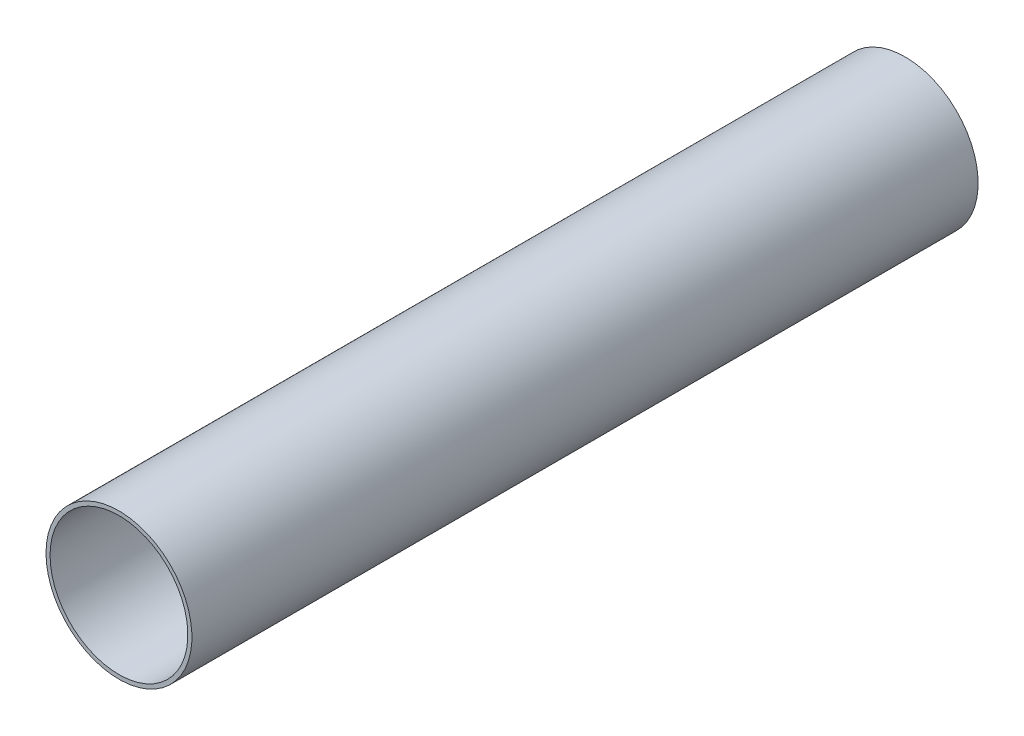
ISO-10303-21;
HEADER;
FILE_DESCRIPTION(('STEP AP214'),'2;1');
FILE_NAME('part.step','',(''),(''),'','','');
FILE_SCHEMA(('AUTOMOTIVE_DESIGN { 1 0 10303 214 1 1 1 1 }'));
ENDSEC;
DATA;
#1=APPLICATION_CONTEXT('core data for automotive mechanical design processes');
#2=APPLICATION_PROTOCOL_DEFINITION('international standard','automotive_design',2000,#1);
#3=PRODUCT_CONTEXT('',#1,'mechanical');
#4=PRODUCT('Part','Part','',(#3));
#5=PRODUCT_RELATED_PRODUCT_CATEGORY('part','',(#4));
#6=PRODUCT_DEFINITION_FORMATION('','',#4);
#7=PRODUCT_DEFINITION_CONTEXT('part definition',#1,'design');
#8=PRODUCT_DEFINITION('design','',#6,#7);
#9=PRODUCT_DEFINITION_SHAPE('','',#8);
#10=(LENGTH_UNIT() NAMED_UNIT(*) SI_UNIT(.MILLI.,.METRE.));
#11=(NAMED_UNIT(*) PLANE_ANGLE_UNIT() SI_UNIT($,.RADIAN.));
#12=(NAMED_UNIT(*) SI_UNIT($,.STERADIAN.) SOLID_ANGLE_UNIT());
#13=UNCERTAINTY_MEASURE_WITH_UNIT(LENGTH_MEASURE(1.E-05),#10,'distance_accuracy_value','');
#14=(GEOMETRIC_REPRESENTATION_CONTEXT(3) GLOBAL_UNCERTAINTY_ASSIGNED_CONTEXT((#13)) GLOBAL_UNIT_ASSIGNED_CONTEXT((#10,
#11,#12)) REPRESENTATION_CONTEXT('',''));
#15=CARTESIAN_POINT('',(0.,0.,0.));
#16=DIRECTION('',(0.,0.,1.));
#17=DIRECTION('',(1.,0.,0.));
#18=AXIS2_PLACEMENT_3D('',#15,#16,#17);
#19=CARTESIAN_POINT('',(0.,0.,0.));
#20=DIRECTION('',(0.,0.,1.));
#21=DIRECTION('',(1.,0.,0.));
#22=AXIS2_PLACEMENT_3D('',#19,#20,#21);
#23=CYLINDRICAL_SURFACE('',#22,9.);
#24=CARTESIAN_POINT('',(0.,0.,97.));
#25=DIRECTION('',(0.,0.,1.));
#26=DIRECTION('',(1.,0.,0.));
#27=AXIS2_PLACEMENT_3D('',#24,#25,#26);
#28=CIRCLE('',#27,9.);
#29=CARTESIAN_POINT('',(-9.,0.,97.));
#30=VERTEX_POINT('',#29);
#31=EDGE_CURVE('E26',#30,#30,#28,.T.);
#32=ORIENTED_EDGE('',*,*,#31,.F.);
#33=DIRECTION('',(0.,0.,-1.));
#34=VECTOR('',#33,1.);
#35=CARTESIAN_POINT('',(-9.,0.,0.));
#36=LINE('',#35,#34);
#37=CARTESIAN_POINT('',(-9.,0.,0.));
#38=VERTEX_POINT('',#37);
#39=EDGE_CURVE('E11',#30,#38,#36,.T.);
#40=ORIENTED_EDGE('',*,*,#39,.T.);
#41=CARTESIAN_POINT('',(0.,0.,0.));
#42=DIRECTION('',(0.,0.,1.));
#43=DIRECTION('',(1.,0.,0.));
#44=AXIS2_PLACEMENT_3D('',#41,#42,#43);
#45=CIRCLE('',#44,9.);
#46=EDGE_CURVE('E52',#38,#38,#45,.T.);
#47=ORIENTED_EDGE('',*,*,#46,.T.);
#48=ORIENTED_EDGE('',*,*,#39,.F.);
#49=EDGE_LOOP('',(#32,#40,#47,#48));
#50=FACE_BOUND('',#49,.T.);
#51=ADVANCED_FACE('F17',(#50),#23,.T.);
#52=CARTESIAN_POINT('',(0.,0.,97.));
#53=DIRECTION('',(0.,0.,1.));
#54=DIRECTION('',(1.,0.,0.));
#55=AXIS2_PLACEMENT_3D('',#52,#53,#54);
#56=PLANE('',#55);
#57=CARTESIAN_POINT('',(0.,0.,97.));
#58=DIRECTION('',(0.,0.,-1.));
#59=DIRECTION('',(1.,0.,0.));
#60=AXIS2_PLACEMENT_3D('',#57,#58,#59);
#61=CIRCLE('',#60,8.5);
#62=CARTESIAN_POINT('',(-8.5,0.,97.));
#63=VERTEX_POINT('',#62);
#64=EDGE_CURVE('E44',#63,#63,#61,.T.);
#65=ORIENTED_EDGE('',*,*,#64,.T.);
#66=EDGE_LOOP('',(#65));
#67=FACE_BOUND('',#66,.T.);
#68=ORIENTED_EDGE('',*,*,#31,.T.);
#69=EDGE_LOOP('',(#68));
#70=FACE_BOUND('',#69,.T.);
#71=ADVANCED_FACE('F85',(#67,#70),#56,.T.);
#72=CARTESIAN_POINT('',(0.,0.,0.));
#73=DIRECTION('',(0.,0.,1.));
#74=DIRECTION('',(1.,0.,0.));
#75=AXIS2_PLACEMENT_3D('',#72,#73,#74);
#76=CYLINDRICAL_SURFACE('',#75,8.5);
#77=CARTESIAN_POINT('',(0.,0.,0.));
#78=DIRECTION('',(0.,0.,-1.));
#79=DIRECTION('',(1.,0.,0.));
#80=AXIS2_PLACEMENT_3D('',#77,#78,#79);
#81=CIRCLE('',#80,8.5);
#82=CARTESIAN_POINT('',(-8.5,0.,0.));
#83=VERTEX_POINT('',#82);
#84=EDGE_CURVE('E20',#83,#83,#81,.T.);
#85=ORIENTED_EDGE('',*,*,#84,.T.);
#86=DIRECTION('',(0.,0.,1.));
#87=VECTOR('',#86,1.);
#88=CARTESIAN_POINT('',(-8.5,0.,0.));
#89=LINE('',#88,#87);
#90=EDGE_CURVE('E60',#83,#63,#89,.T.);
#91=ORIENTED_EDGE('',*,*,#90,.T.);
#92=ORIENTED_EDGE('',*,*,#64,.F.);
#93=ORIENTED_EDGE('',*,*,#90,.F.);
#94=EDGE_LOOP('',(#85,#91,#92,#93));
#95=FACE_BOUND('',#94,.T.);
#96=ADVANCED_FACE('F75',(#95),#76,.F.);
#97=CARTESIAN_POINT('',(0.,0.,0.));
#98=DIRECTION('',(0.,0.,1.));
#99=DIRECTION('',(1.,0.,0.));
#100=AXIS2_PLACEMENT_3D('',#97,#98,#99);
#101=PLANE('',#100);
#102=ORIENTED_EDGE('',*,*,#84,.F.);
#103=EDGE_LOOP('',(#102));
#104=FACE_BOUND('',#103,.T.);
#105=ORIENTED_EDGE('',*,*,#46,.F.);
#106=EDGE_LOOP('',(#105));
#107=FACE_BOUND('',#106,.T.);
#108=ADVANCED_FACE('F77',(#104,#107),#101,.F.);
#109=CLOSED_SHELL('',(#51,#71,#96,#108));
#110=MANIFOLD_SOLID_BREP('B1',#109);
#111=ADVANCED_BREP_SHAPE_REPRESENTATION('',(#18,#110),#14);
#112=SHAPE_DEFINITION_REPRESENTATION(#9,#111);
ENDSEC;
END-ISO-10303-21;
